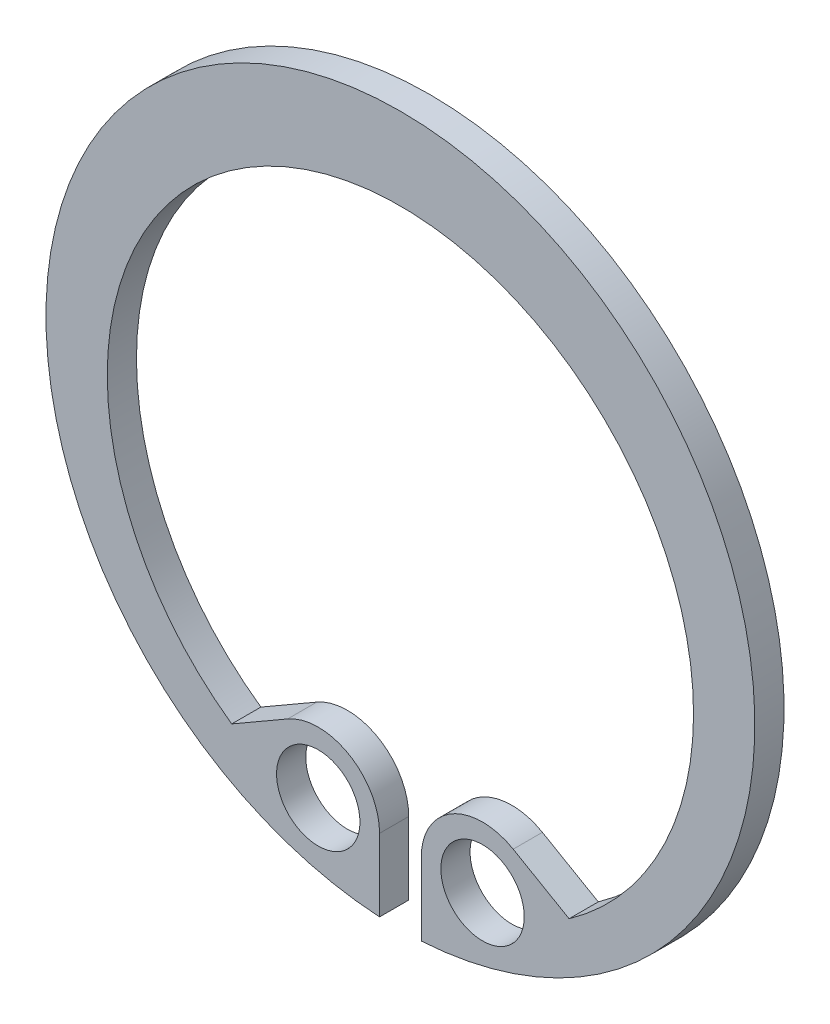
ISO-10303-21;
HEADER;
FILE_DESCRIPTION(('STEP AP214'),'2;1');
FILE_NAME('part.step','',(''),(''),'','','');
FILE_SCHEMA(('AUTOMOTIVE_DESIGN { 1 0 10303 214 1 1 1 1 }'));
ENDSEC;
DATA;
#1=APPLICATION_CONTEXT('core data for automotive mechanical design processes');
#2=APPLICATION_PROTOCOL_DEFINITION('international standard','automotive_design',2000,#1);
#3=PRODUCT_CONTEXT('',#1,'mechanical');
#4=PRODUCT('Part','Part','',(#3));
#5=PRODUCT_RELATED_PRODUCT_CATEGORY('part','',(#4));
#6=PRODUCT_DEFINITION_FORMATION('','',#4);
#7=PRODUCT_DEFINITION_CONTEXT('part definition',#1,'design');
#8=PRODUCT_DEFINITION('design','',#6,#7);
#9=PRODUCT_DEFINITION_SHAPE('','',#8);
#10=(LENGTH_UNIT() NAMED_UNIT(*) SI_UNIT(.MILLI.,.METRE.));
#11=(NAMED_UNIT(*) PLANE_ANGLE_UNIT() SI_UNIT($,.RADIAN.));
#12=(NAMED_UNIT(*) SI_UNIT($,.STERADIAN.) SOLID_ANGLE_UNIT());
#13=UNCERTAINTY_MEASURE_WITH_UNIT(LENGTH_MEASURE(1.E-05),#10,'distance_accuracy_value','');
#14=(GEOMETRIC_REPRESENTATION_CONTEXT(3) GLOBAL_UNCERTAINTY_ASSIGNED_CONTEXT((#13)) GLOBAL_UNIT_ASSIGNED_CONTEXT((#10,
#11,#12)) REPRESENTATION_CONTEXT('',''));
#15=CARTESIAN_POINT('',(0.,0.,0.));
#16=DIRECTION('',(0.,0.,1.));
#17=DIRECTION('',(1.,0.,0.));
#18=AXIS2_PLACEMENT_3D('',#15,#16,#17);
#19=CARTESIAN_POINT('',(-151.073938512802,-116.458302037008,0.55));
#20=DIRECTION('',(0.,0.,-1.));
#21=DIRECTION('',(1.,0.,0.));
#22=AXIS2_PLACEMENT_3D('',#19,#20,#21);
#23=CYLINDRICAL_SURFACE('',#22,2.5);
#24=CARTESIAN_POINT('',(-151.073938512802,-116.458302037008,-1.2));
#25=DIRECTION('',(0.,0.,1.));
#26=DIRECTION('',(1.,0.,0.));
#27=AXIS2_PLACEMENT_3D('',#24,#25,#26);
#28=CIRCLE('',#27,2.5);
#29=CARTESIAN_POINT('',(-148.573938512802,-116.458302037008,-1.2));
#30=VERTEX_POINT('',#29);
#31=EDGE_CURVE('E11',#30,#30,#28,.T.);
#32=ORIENTED_EDGE('',*,*,#31,.F.);
#33=EDGE_LOOP('',(#32));
#34=FACE_BOUND('',#33,.T.);
#35=CARTESIAN_POINT('',(-151.073938512802,-116.458302037008,0.55));
#36=DIRECTION('',(0.,0.,-1.));
#37=DIRECTION('',(1.,0.,0.));
#38=AXIS2_PLACEMENT_3D('',#35,#36,#37);
#39=CIRCLE('',#38,2.5);
#40=CARTESIAN_POINT('',(-148.573938512802,-116.458302037008,0.55));
#41=VERTEX_POINT('',#40);
#42=EDGE_CURVE('E125',#41,#41,#39,.T.);
#43=ORIENTED_EDGE('',*,*,#42,.F.);
#44=EDGE_LOOP('',(#43));
#45=FACE_BOUND('',#44,.T.);
#46=ADVANCED_FACE('F16',(#34,#45),#23,.F.);
#47=CARTESIAN_POINT('',(-168.461437397774,-77.2758898831014,-1.2));
#48=DIRECTION('',(0.,0.,-1.));
#49=DIRECTION('',(0.,-1.,0.));
#50=AXIS2_PLACEMENT_3D('',#47,#48,#49);
#51=PLANE('',#50);
#52=DIRECTION('',(0.,-1.,0.));
#53=VECTOR('',#52,1.);
#54=CARTESIAN_POINT('',(-147.398938512802,-116.458302037008,-1.2));
#55=LINE('',#54,#53);
#56=CARTESIAN_POINT('',(-147.398938512802,-116.458302037008,-1.2));
#57=VERTEX_POINT('',#56);
#58=CARTESIAN_POINT('',(-147.398938512802,-120.800672653802,-1.2));
#59=VERTEX_POINT('',#58);
#60=EDGE_CURVE('E25',#57,#59,#55,.T.);
#61=ORIENTED_EDGE('',*,*,#60,.T.);
#62=CARTESIAN_POINT('',(-146.148938512802,-99.5874692182053,-1.2));
#63=DIRECTION('',(0.,0.,-1.));
#64=DIRECTION('',(-0.0588235294117635,-0.998268396969244,0.));
#65=AXIS2_PLACEMENT_3D('',#62,#63,#64);
#66=CIRCLE('',#65,21.25);
#67=CARTESIAN_POINT('',(-144.898938512802,-120.800672653802,-1.2));
#68=VERTEX_POINT('',#67);
#69=EDGE_CURVE('E142',#59,#68,#66,.T.);
#70=ORIENTED_EDGE('',*,*,#69,.T.);
#71=DIRECTION('',(0.,1.,0.));
#72=VECTOR('',#71,1.);
#73=CARTESIAN_POINT('',(-144.898938512802,-120.800672653802,-1.2));
#74=LINE('',#73,#72);
#75=CARTESIAN_POINT('',(-144.898938512802,-116.458302037016,-1.2));
#76=VERTEX_POINT('',#75);
#77=EDGE_CURVE('E130',#68,#76,#74,.T.);
#78=ORIENTED_EDGE('',*,*,#77,.T.);
#79=CARTESIAN_POINT('',(-141.223938512802,-116.458302037016,-1.2));
#80=DIRECTION('',(0.,0.,-1.));
#81=DIRECTION('',(-1.,0.,0.));
#82=AXIS2_PLACEMENT_3D('',#79,#80,#81);
#83=CIRCLE('',#82,3.675);
#84=CARTESIAN_POINT('',(-139.386438512802,-113.275658678108,-1.2));
#85=VERTEX_POINT('',#84);
#86=EDGE_CURVE('E190',#76,#85,#83,.T.);
#87=ORIENTED_EDGE('',*,*,#86,.T.);
#88=DIRECTION('',(0.86602540378444,-0.5,0.));
#89=VECTOR('',#88,1.);
#90=CARTESIAN_POINT('',(-139.386438512802,-113.275658678108,-1.2));
#91=LINE('',#90,#89);
#92=CARTESIAN_POINT('',(-136.034955955454,-115.210638034777,-1.2));
#93=VERTEX_POINT('',#92);
#94=EDGE_CURVE('E156',#85,#93,#91,.T.);
#95=ORIENTED_EDGE('',*,*,#94,.T.);
#96=CARTESIAN_POINT('',(-146.148938512802,-100.837469218205,-1.2));
#97=DIRECTION('',(0.,0.,1.));
#98=DIRECTION('',(0.575475536691191,-0.817818993830533,0.));
#99=AXIS2_PLACEMENT_3D('',#96,#97,#98);
#100=CIRCLE('',#99,17.575);
#101=CARTESIAN_POINT('',(-156.262921070156,-115.210638034773,-1.2));
#102=VERTEX_POINT('',#101);
#103=EDGE_CURVE('E151',#93,#102,#100,.T.);
#104=ORIENTED_EDGE('',*,*,#103,.T.);
#105=DIRECTION('',(0.866025403784438,0.5,0.));
#106=VECTOR('',#105,1.);
#107=CARTESIAN_POINT('',(-156.262921070156,-115.210638034773,-1.2));
#108=LINE('',#107,#106);
#109=CARTESIAN_POINT('',(-152.911438512802,-113.2756586781,-1.2));
#110=VERTEX_POINT('',#109);
#111=EDGE_CURVE('E150',#102,#110,#108,.T.);
#112=ORIENTED_EDGE('',*,*,#111,.T.);
#113=CARTESIAN_POINT('',(-151.073938512802,-116.458302037008,-1.2));
#114=DIRECTION('',(0.,0.,-1.));
#115=DIRECTION('',(-0.499999999999945,0.86602540378447,0.));
#116=AXIS2_PLACEMENT_3D('',#113,#114,#115);
#117=CIRCLE('',#116,3.675);
#118=EDGE_CURVE('E209',#110,#57,#117,.T.);
#119=ORIENTED_EDGE('',*,*,#118,.T.);
#120=EDGE_LOOP('',(#61,#70,#78,#87,#95,#104,#112,#119));
#121=FACE_BOUND('',#120,.T.);
#122=CARTESIAN_POINT('',(-141.223938512802,-116.458302037016,-1.2));
#123=DIRECTION('',(0.,0.,1.));
#124=DIRECTION('',(1.,0.,0.));
#125=AXIS2_PLACEMENT_3D('',#122,#123,#124);
#126=CIRCLE('',#125,2.5);
#127=CARTESIAN_POINT('',(-138.723938512802,-116.458302037016,-1.2));
#128=VERTEX_POINT('',#127);
#129=EDGE_CURVE('E120',#128,#128,#126,.T.);
#130=ORIENTED_EDGE('',*,*,#129,.T.);
#131=EDGE_LOOP('',(#130));
#132=FACE_BOUND('',#131,.T.);
#133=ORIENTED_EDGE('',*,*,#31,.T.);
#134=EDGE_LOOP('',(#133));
#135=FACE_BOUND('',#134,.T.);
#136=ADVANCED_FACE('F18',(#121,#132,#135),#51,.T.);
#137=CARTESIAN_POINT('',(-147.398938512802,-120.800672653802,-1.2));
#138=DIRECTION('',(1.,0.,0.));
#139=DIRECTION('',(0.,-1.,0.));
#140=AXIS2_PLACEMENT_3D('',#137,#138,#139);
#141=PLANE('',#140);
#142=ORIENTED_EDGE('',*,*,#60,.F.);
#143=DIRECTION('',(0.,0.,1.));
#144=VECTOR('',#143,1.);
#145=CARTESIAN_POINT('',(-147.398938512802,-116.458302037008,-1.2));
#146=LINE('',#145,#144);
#147=CARTESIAN_POINT('',(-147.398938512802,-116.458302037008,0.55));
#148=VERTEX_POINT('',#147);
#149=EDGE_CURVE('E213',#57,#148,#146,.T.);
#150=ORIENTED_EDGE('',*,*,#149,.T.);
#151=DIRECTION('',(0.,1.,0.));
#152=VECTOR('',#151,1.);
#153=CARTESIAN_POINT('',(-147.398938512802,-120.800672653802,0.55));
#154=LINE('',#153,#152);
#155=CARTESIAN_POINT('',(-147.398938512802,-120.800672653802,0.55));
#156=VERTEX_POINT('',#155);
#157=EDGE_CURVE('E169',#156,#148,#154,.T.);
#158=ORIENTED_EDGE('',*,*,#157,.F.);
#159=DIRECTION('',(0.,0.,1.));
#160=VECTOR('',#159,1.);
#161=CARTESIAN_POINT('',(-147.398938512802,-120.800672653802,-1.2));
#162=LINE('',#161,#160);
#163=EDGE_CURVE('E131',#59,#156,#162,.T.);
#164=ORIENTED_EDGE('',*,*,#163,.F.);
#165=EDGE_LOOP('',(#142,#150,#158,#164));
#166=FACE_BOUND('',#165,.T.);
#167=ADVANCED_FACE('F221',(#166),#141,.T.);
#168=CARTESIAN_POINT('',(-151.073938512802,-116.458302037008,-1.2));
#169=DIRECTION('',(0.,0.,1.));
#170=DIRECTION('',(1.,0.,0.));
#171=AXIS2_PLACEMENT_3D('',#168,#169,#170);
#172=CYLINDRICAL_SURFACE('',#171,3.675);
#173=ORIENTED_EDGE('',*,*,#118,.F.);
#174=DIRECTION('',(0.,0.,-1.));
#175=VECTOR('',#174,1.);
#176=CARTESIAN_POINT('',(-152.911438512802,-113.2756586781,0.55));
#177=LINE('',#176,#175);
#178=CARTESIAN_POINT('',(-152.911438512802,-113.2756586781,0.55));
#179=VERTEX_POINT('',#178);
#180=EDGE_CURVE('E205',#179,#110,#177,.T.);
#181=ORIENTED_EDGE('',*,*,#180,.F.);
#182=CARTESIAN_POINT('',(-151.073938512802,-116.458302037008,0.55));
#183=DIRECTION('',(0.,0.,1.));
#184=DIRECTION('',(1.,0.,0.));
#185=AXIS2_PLACEMENT_3D('',#182,#183,#184);
#186=CIRCLE('',#185,3.675);
#187=EDGE_CURVE('E133',#148,#179,#186,.T.);
#188=ORIENTED_EDGE('',*,*,#187,.F.);
#189=ORIENTED_EDGE('',*,*,#149,.F.);
#190=EDGE_LOOP('',(#173,#181,#188,#189));
#191=FACE_BOUND('',#190,.T.);
#192=ADVANCED_FACE('F245',(#191),#172,.T.);
#193=CARTESIAN_POINT('',(-152.911438512802,-113.2756586781,-1.2));
#194=DIRECTION('',(-0.5,0.866025403784438,0.));
#195=DIRECTION('',(0.,0.,1.));
#196=AXIS2_PLACEMENT_3D('',#193,#194,#195);
#197=PLANE('',#196);
#198=ORIENTED_EDGE('',*,*,#111,.F.);
#199=DIRECTION('',(0.,0.,1.));
#200=VECTOR('',#199,1.);
#201=CARTESIAN_POINT('',(-156.262921070156,-115.210638034773,-1.2));
#202=LINE('',#201,#200);
#203=CARTESIAN_POINT('',(-156.262921070156,-115.210638034773,0.55));
#204=VERTEX_POINT('',#203);
#205=EDGE_CURVE('E147',#102,#204,#202,.T.);
#206=ORIENTED_EDGE('',*,*,#205,.T.);
#207=DIRECTION('',(-0.866025403784438,-0.5,0.));
#208=VECTOR('',#207,1.);
#209=CARTESIAN_POINT('',(-152.911438512802,-113.2756586781,0.55));
#210=LINE('',#209,#208);
#211=EDGE_CURVE('E137',#179,#204,#210,.T.);
#212=ORIENTED_EDGE('',*,*,#211,.F.);
#213=ORIENTED_EDGE('',*,*,#180,.T.);
#214=EDGE_LOOP('',(#198,#206,#212,#213));
#215=FACE_BOUND('',#214,.T.);
#216=ADVANCED_FACE('F241',(#215),#197,.T.);
#217=CARTESIAN_POINT('',(-146.148938512802,-100.837469218205,0.55));
#218=DIRECTION('',(0.,0.,-1.));
#219=DIRECTION('',(-0.575475536691521,-0.817818993830301,0.));
#220=AXIS2_PLACEMENT_3D('',#217,#218,#219);
#221=CYLINDRICAL_SURFACE('',#220,17.575);
#222=ORIENTED_EDGE('',*,*,#103,.F.);
#223=DIRECTION('',(0.,0.,-1.));
#224=VECTOR('',#223,1.);
#225=CARTESIAN_POINT('',(-136.034955955454,-115.210638034777,0.55));
#226=LINE('',#225,#224);
#227=CARTESIAN_POINT('',(-136.034955955454,-115.210638034777,0.55));
#228=VERTEX_POINT('',#227);
#229=EDGE_CURVE('E160',#228,#93,#226,.T.);
#230=ORIENTED_EDGE('',*,*,#229,.F.);
#231=CARTESIAN_POINT('',(-146.148938512802,-100.837469218205,0.55));
#232=DIRECTION('',(0.,0.,-1.));
#233=DIRECTION('',(-0.575475536691521,-0.817818993830301,0.));
#234=AXIS2_PLACEMENT_3D('',#231,#232,#233);
#235=CIRCLE('',#234,17.575);
#236=EDGE_CURVE('E146',#204,#228,#235,.T.);
#237=ORIENTED_EDGE('',*,*,#236,.F.);
#238=ORIENTED_EDGE('',*,*,#205,.F.);
#239=EDGE_LOOP('',(#222,#230,#237,#238));
#240=FACE_BOUND('',#239,.T.);
#241=ADVANCED_FACE('F238',(#240),#221,.F.);
#242=CARTESIAN_POINT('',(-136.034955955454,-115.210638034777,-1.2));
#243=DIRECTION('',(0.5,0.86602540378444,0.));
#244=DIRECTION('',(0.,0.,-1.));
#245=AXIS2_PLACEMENT_3D('',#242,#243,#244);
#246=PLANE('',#245);
#247=ORIENTED_EDGE('',*,*,#94,.F.);
#248=DIRECTION('',(0.,0.,1.));
#249=VECTOR('',#248,1.);
#250=CARTESIAN_POINT('',(-139.386438512802,-113.275658678108,-1.2));
#251=LINE('',#250,#249);
#252=CARTESIAN_POINT('',(-139.386438512802,-113.275658678108,0.55));
#253=VERTEX_POINT('',#252);
#254=EDGE_CURVE('E161',#85,#253,#251,.T.);
#255=ORIENTED_EDGE('',*,*,#254,.T.);
#256=DIRECTION('',(-0.86602540378444,0.5,0.));
#257=VECTOR('',#256,1.);
#258=CARTESIAN_POINT('',(-136.034955955454,-115.210638034777,0.55));
#259=LINE('',#258,#257);
#260=EDGE_CURVE('E155',#228,#253,#259,.T.);
#261=ORIENTED_EDGE('',*,*,#260,.F.);
#262=ORIENTED_EDGE('',*,*,#229,.T.);
#263=EDGE_LOOP('',(#247,#255,#261,#262));
#264=FACE_BOUND('',#263,.T.);
#265=ADVANCED_FACE('F235',(#264),#246,.T.);
#266=CARTESIAN_POINT('',(-141.223938512802,-116.458302037016,-1.2));
#267=DIRECTION('',(0.,0.,1.));
#268=DIRECTION('',(0.500000000000081,0.866025403784392,0.));
#269=AXIS2_PLACEMENT_3D('',#266,#267,#268);
#270=CYLINDRICAL_SURFACE('',#269,3.675);
#271=ORIENTED_EDGE('',*,*,#86,.F.);
#272=DIRECTION('',(0.,0.,1.));
#273=VECTOR('',#272,1.);
#274=CARTESIAN_POINT('',(-144.898938512802,-116.458302037016,-1.2));
#275=LINE('',#274,#273);
#276=CARTESIAN_POINT('',(-144.898938512802,-116.458302037016,0.55));
#277=VERTEX_POINT('',#276);
#278=EDGE_CURVE('E187',#76,#277,#275,.T.);
#279=ORIENTED_EDGE('',*,*,#278,.T.);
#280=CARTESIAN_POINT('',(-141.223938512802,-116.458302037016,0.55));
#281=DIRECTION('',(0.,0.,1.));
#282=DIRECTION('',(0.500000000000082,0.866025403784392,0.));
#283=AXIS2_PLACEMENT_3D('',#280,#281,#282);
#284=CIRCLE('',#283,3.675);
#285=EDGE_CURVE('E165',#253,#277,#284,.T.);
#286=ORIENTED_EDGE('',*,*,#285,.F.);
#287=ORIENTED_EDGE('',*,*,#254,.F.);
#288=EDGE_LOOP('',(#271,#279,#286,#287));
#289=FACE_BOUND('',#288,.T.);
#290=ADVANCED_FACE('F231',(#289),#270,.T.);
#291=CARTESIAN_POINT('',(-144.898938512802,-116.458302037016,-1.2));
#292=DIRECTION('',(-1.,0.,0.));
#293=DIRECTION('',(0.,0.,1.));
#294=AXIS2_PLACEMENT_3D('',#291,#292,#293);
#295=PLANE('',#294);
#296=ORIENTED_EDGE('',*,*,#77,.F.);
#297=DIRECTION('',(0.,0.,-1.));
#298=VECTOR('',#297,1.);
#299=CARTESIAN_POINT('',(-144.898938512802,-120.800672653802,0.55));
#300=LINE('',#299,#298);
#301=CARTESIAN_POINT('',(-144.898938512802,-120.800672653802,0.55));
#302=VERTEX_POINT('',#301);
#303=EDGE_CURVE('E128',#302,#68,#300,.T.);
#304=ORIENTED_EDGE('',*,*,#303,.F.);
#305=DIRECTION('',(0.,-1.,0.));
#306=VECTOR('',#305,1.);
#307=CARTESIAN_POINT('',(-144.898938512802,-116.458302037016,0.55));
#308=LINE('',#307,#306);
#309=EDGE_CURVE('E174',#277,#302,#308,.T.);
#310=ORIENTED_EDGE('',*,*,#309,.F.);
#311=ORIENTED_EDGE('',*,*,#278,.F.);
#312=EDGE_LOOP('',(#296,#304,#310,#311));
#313=FACE_BOUND('',#312,.T.);
#314=ADVANCED_FACE('F227',(#313),#295,.T.);
#315=CARTESIAN_POINT('',(-146.148938512802,-99.5874692182053,-1.2));
#316=DIRECTION('',(0.,0.,1.));
#317=DIRECTION('',(0.0588235294117686,-0.998268396969243,0.));
#318=AXIS2_PLACEMENT_3D('',#315,#316,#317);
#319=CYLINDRICAL_SURFACE('',#318,21.25);
#320=ORIENTED_EDGE('',*,*,#69,.F.);
#321=ORIENTED_EDGE('',*,*,#163,.T.);
#322=CARTESIAN_POINT('',(-146.148938512802,-99.5874692182053,0.55));
#323=DIRECTION('',(0.,0.,1.));
#324=DIRECTION('',(0.0588235294117686,-0.998268396969243,0.));
#325=AXIS2_PLACEMENT_3D('',#322,#323,#324);
#326=CIRCLE('',#325,21.25);
#327=EDGE_CURVE('E170',#302,#156,#326,.T.);
#328=ORIENTED_EDGE('',*,*,#327,.F.);
#329=ORIENTED_EDGE('',*,*,#303,.T.);
#330=EDGE_LOOP('',(#320,#321,#328,#329));
#331=FACE_BOUND('',#330,.T.);
#332=ADVANCED_FACE('F224',(#331),#319,.T.);
#333=CARTESIAN_POINT('',(-123.836438232239,-121.862252200306,0.55));
#334=DIRECTION('',(0.,0.,1.));
#335=DIRECTION('',(1.,0.,0.));
#336=AXIS2_PLACEMENT_3D('',#333,#334,#335);
#337=PLANE('',#336);
#338=ORIENTED_EDGE('',*,*,#187,.T.);
#339=ORIENTED_EDGE('',*,*,#211,.T.);
#340=ORIENTED_EDGE('',*,*,#236,.T.);
#341=ORIENTED_EDGE('',*,*,#260,.T.);
#342=ORIENTED_EDGE('',*,*,#285,.T.);
#343=ORIENTED_EDGE('',*,*,#309,.T.);
#344=ORIENTED_EDGE('',*,*,#327,.T.);
#345=ORIENTED_EDGE('',*,*,#157,.T.);
#346=EDGE_LOOP('',(#338,#339,#340,#341,#342,#343,#344,#345));
#347=FACE_BOUND('',#346,.T.);
#348=CARTESIAN_POINT('',(-141.223938512802,-116.458302037016,0.55));
#349=DIRECTION('',(0.,0.,-1.));
#350=DIRECTION('',(1.,0.,0.));
#351=AXIS2_PLACEMENT_3D('',#348,#349,#350);
#352=CIRCLE('',#351,2.5);
#353=CARTESIAN_POINT('',(-138.723938512802,-116.458302037016,0.55));
#354=VERTEX_POINT('',#353);
#355=EDGE_CURVE('E115',#354,#354,#352,.T.);
#356=ORIENTED_EDGE('',*,*,#355,.T.);
#357=EDGE_LOOP('',(#356));
#358=FACE_BOUND('',#357,.T.);
#359=ORIENTED_EDGE('',*,*,#42,.T.);
#360=EDGE_LOOP('',(#359));
#361=FACE_BOUND('',#360,.T.);
#362=ADVANCED_FACE('F116',(#347,#358,#361),#337,.T.);
#363=CARTESIAN_POINT('',(-141.223938512802,-116.458302037016,0.55));
#364=DIRECTION('',(0.,0.,-1.));
#365=DIRECTION('',(1.,0.,0.));
#366=AXIS2_PLACEMENT_3D('',#363,#364,#365);
#367=CYLINDRICAL_SURFACE('',#366,2.5);
#368=ORIENTED_EDGE('',*,*,#129,.F.);
#369=EDGE_LOOP('',(#368));
#370=FACE_BOUND('',#369,.T.);
#371=ORIENTED_EDGE('',*,*,#355,.F.);
#372=EDGE_LOOP('',(#371));
#373=FACE_BOUND('',#372,.T.);
#374=ADVANCED_FACE('F248',(#370,#373),#367,.F.);
#375=CLOSED_SHELL('',(#46,#136,#167,#192,#216,#241,#265,#290,#314,#332,#362,#374));
#376=MANIFOLD_SOLID_BREP('B1',#375);
#377=ADVANCED_BREP_SHAPE_REPRESENTATION('',(#18,#376),#14);
#378=SHAPE_DEFINITION_REPRESENTATION(#9,#377);
ENDSEC;
END-ISO-10303-21;
